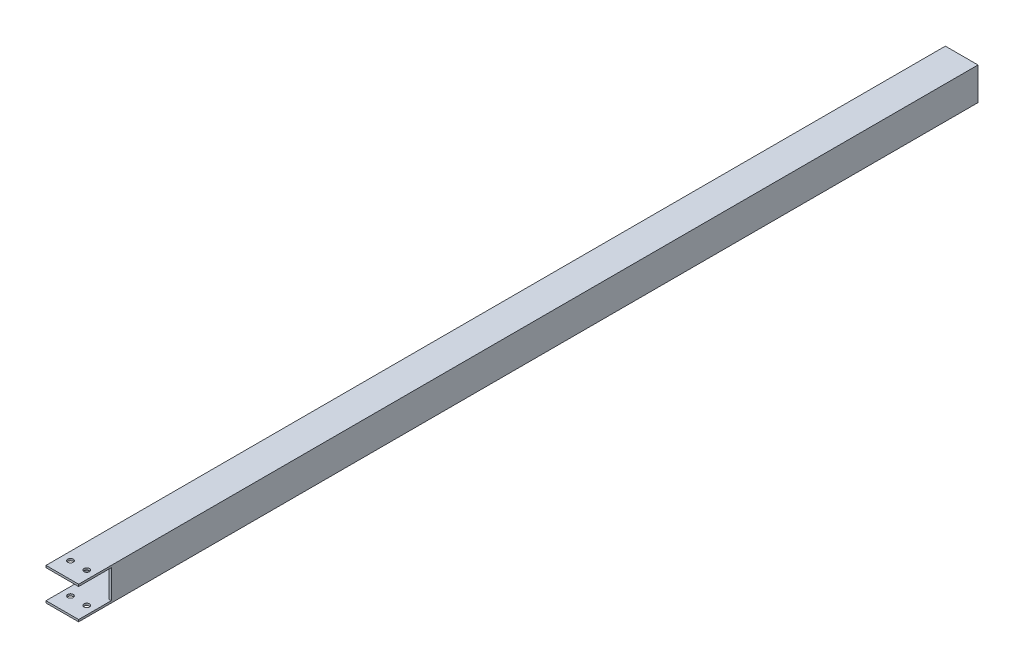
ISO-10303-21;
HEADER;
FILE_DESCRIPTION(('STEP AP214'),'2;1');
FILE_NAME('part.step','',(''),(''),'','','');
FILE_SCHEMA(('AUTOMOTIVE_DESIGN { 1 0 10303 214 1 1 1 1 }'));
ENDSEC;
DATA;
#1=APPLICATION_CONTEXT('core data for automotive mechanical design processes');
#2=APPLICATION_PROTOCOL_DEFINITION('international standard','automotive_design',2000,#1);
#3=PRODUCT_CONTEXT('',#1,'mechanical');
#4=PRODUCT('Part','Part','',(#3));
#5=PRODUCT_RELATED_PRODUCT_CATEGORY('part','',(#4));
#6=PRODUCT_DEFINITION_FORMATION('','',#4);
#7=PRODUCT_DEFINITION_CONTEXT('part definition',#1,'design');
#8=PRODUCT_DEFINITION('design','',#6,#7);
#9=PRODUCT_DEFINITION_SHAPE('','',#8);
#10=(LENGTH_UNIT() NAMED_UNIT(*) SI_UNIT(.MILLI.,.METRE.));
#11=(NAMED_UNIT(*) PLANE_ANGLE_UNIT() SI_UNIT($,.RADIAN.));
#12=(NAMED_UNIT(*) SI_UNIT($,.STERADIAN.) SOLID_ANGLE_UNIT());
#13=UNCERTAINTY_MEASURE_WITH_UNIT(LENGTH_MEASURE(1.E-05),#10,'distance_accuracy_value','');
#14=(GEOMETRIC_REPRESENTATION_CONTEXT(3) GLOBAL_UNCERTAINTY_ASSIGNED_CONTEXT((#13)) GLOBAL_UNIT_ASSIGNED_CONTEXT((#10,
#11,#12)) REPRESENTATION_CONTEXT('',''));
#15=CARTESIAN_POINT('',(0.,0.,0.));
#16=DIRECTION('',(0.,0.,1.));
#17=DIRECTION('',(1.,0.,0.));
#18=AXIS2_PLACEMENT_3D('',#15,#16,#17);
#19=CARTESIAN_POINT('',(0.,0.,350.));
#20=DIRECTION('',(0.,0.,1.));
#21=DIRECTION('',(1.,0.,0.));
#22=AXIS2_PLACEMENT_3D('',#19,#20,#21);
#23=PLANE('',#22);
#24=DIRECTION('',(-1.,0.,0.));
#25=VECTOR('',#24,1.);
#26=CARTESIAN_POINT('',(-11.1125,11.1125,350.));
#27=LINE('',#26,#25);
#28=CARTESIAN_POINT('',(12.7,11.1125,350.));
#29=VERTEX_POINT('',#28);
#30=CARTESIAN_POINT('',(-12.7,11.1125,350.));
#31=VERTEX_POINT('',#30);
#32=EDGE_CURVE('E141',#29,#31,#27,.T.);
#33=ORIENTED_EDGE('',*,*,#32,.F.);
#34=DIRECTION('',(0.,1.,0.));
#35=VECTOR('',#34,1.);
#36=CARTESIAN_POINT('',(12.7,12.7,350.));
#37=LINE('',#36,#35);
#38=CARTESIAN_POINT('',(12.7,12.7,350.));
#39=VERTEX_POINT('',#38);
#40=EDGE_CURVE('E188',#29,#39,#37,.T.);
#41=ORIENTED_EDGE('',*,*,#40,.T.);
#42=DIRECTION('',(-1.,0.,0.));
#43=VECTOR('',#42,1.);
#44=CARTESIAN_POINT('',(-12.7,12.7,350.));
#45=LINE('',#44,#43);
#46=CARTESIAN_POINT('',(-12.7,12.7,350.));
#47=VERTEX_POINT('',#46);
#48=EDGE_CURVE('E162',#39,#47,#45,.T.);
#49=ORIENTED_EDGE('',*,*,#48,.T.);
#50=DIRECTION('',(0.,-1.,0.));
#51=VECTOR('',#50,1.);
#52=CARTESIAN_POINT('',(-12.7,12.7,350.));
#53=LINE('',#52,#51);
#54=EDGE_CURVE('E161',#47,#31,#53,.T.);
#55=ORIENTED_EDGE('',*,*,#54,.T.);
#56=EDGE_LOOP('',(#33,#41,#49,#55));
#57=FACE_BOUND('',#56,.T.);
#58=ADVANCED_FACE('F40',(#57),#23,.T.);
#59=DIRECTION('',(1.,0.,0.));
#60=VECTOR('',#59,1.);
#61=CARTESIAN_POINT('',(-11.1125,-11.1125,350.));
#62=LINE('',#61,#60);
#63=CARTESIAN_POINT('',(-12.7,-11.1125,350.));
#64=VERTEX_POINT('',#63);
#65=CARTESIAN_POINT('',(12.7,-11.1125,350.));
#66=VERTEX_POINT('',#65);
#67=EDGE_CURVE('E131',#64,#66,#62,.T.);
#68=ORIENTED_EDGE('',*,*,#67,.F.);
#69=CARTESIAN_POINT('',(-12.7,-12.7,350.));
#70=VERTEX_POINT('',#69);
#71=EDGE_CURVE('E135',#64,#70,#53,.T.);
#72=ORIENTED_EDGE('',*,*,#71,.T.);
#73=DIRECTION('',(1.,0.,0.));
#74=VECTOR('',#73,1.);
#75=CARTESIAN_POINT('',(-12.7,-12.7,350.));
#76=LINE('',#75,#74);
#77=CARTESIAN_POINT('',(12.7,-12.7,350.));
#78=VERTEX_POINT('',#77);
#79=EDGE_CURVE('E167',#70,#78,#76,.T.);
#80=ORIENTED_EDGE('',*,*,#79,.T.);
#81=EDGE_CURVE('E138',#78,#66,#37,.T.);
#82=ORIENTED_EDGE('',*,*,#81,.T.);
#83=EDGE_LOOP('',(#68,#72,#80,#82));
#84=FACE_BOUND('',#83,.T.);
#85=ADVANCED_FACE('F133',(#84),#23,.T.);
#86=CARTESIAN_POINT('',(0.,0.,-350.));
#87=DIRECTION('',(0.,0.,1.));
#88=DIRECTION('',(1.,0.,0.));
#89=AXIS2_PLACEMENT_3D('',#86,#87,#88);
#90=PLANE('',#89);
#91=DIRECTION('',(0.,1.,0.));
#92=VECTOR('',#91,1.);
#93=CARTESIAN_POINT('',(12.7,12.7,-350.));
#94=LINE('',#93,#92);
#95=CARTESIAN_POINT('',(12.7,-12.7,-350.));
#96=VERTEX_POINT('',#95);
#97=CARTESIAN_POINT('',(12.7,12.7,-350.));
#98=VERTEX_POINT('',#97);
#99=EDGE_CURVE('E174',#96,#98,#94,.T.);
#100=ORIENTED_EDGE('',*,*,#99,.F.);
#101=DIRECTION('',(1.,0.,0.));
#102=VECTOR('',#101,1.);
#103=CARTESIAN_POINT('',(-12.7,-12.7,-350.));
#104=LINE('',#103,#102);
#105=CARTESIAN_POINT('',(-12.7,-12.7,-350.));
#106=VERTEX_POINT('',#105);
#107=EDGE_CURVE('E185',#106,#96,#104,.T.);
#108=ORIENTED_EDGE('',*,*,#107,.F.);
#109=DIRECTION('',(0.,-1.,0.));
#110=VECTOR('',#109,1.);
#111=CARTESIAN_POINT('',(-12.7,12.7,-350.));
#112=LINE('',#111,#110);
#113=CARTESIAN_POINT('',(-12.7,12.7,-350.));
#114=VERTEX_POINT('',#113);
#115=EDGE_CURVE('E182',#114,#106,#112,.T.);
#116=ORIENTED_EDGE('',*,*,#115,.F.);
#117=DIRECTION('',(-1.,0.,0.));
#118=VECTOR('',#117,1.);
#119=CARTESIAN_POINT('',(-12.7,12.7,-350.));
#120=LINE('',#119,#118);
#121=EDGE_CURVE('E178',#98,#114,#120,.T.);
#122=ORIENTED_EDGE('',*,*,#121,.F.);
#123=EDGE_LOOP('',(#100,#108,#116,#122));
#124=FACE_BOUND('',#123,.T.);
#125=DIRECTION('',(0.,1.,0.));
#126=VECTOR('',#125,1.);
#127=CARTESIAN_POINT('',(11.1125,11.1125,-350.));
#128=LINE('',#127,#126);
#129=CARTESIAN_POINT('',(11.1125,-11.1125,-350.));
#130=VERTEX_POINT('',#129);
#131=CARTESIAN_POINT('',(11.1125,11.1125,-350.));
#132=VERTEX_POINT('',#131);
#133=EDGE_CURVE('E206',#130,#132,#128,.T.);
#134=ORIENTED_EDGE('',*,*,#133,.T.);
#135=DIRECTION('',(-1.,0.,0.));
#136=VECTOR('',#135,1.);
#137=CARTESIAN_POINT('',(-11.1125,11.1125,-350.));
#138=LINE('',#137,#136);
#139=CARTESIAN_POINT('',(-11.1125,11.1125,-350.));
#140=VERTEX_POINT('',#139);
#141=EDGE_CURVE('E226',#132,#140,#138,.T.);
#142=ORIENTED_EDGE('',*,*,#141,.T.);
#143=DIRECTION('',(0.,-1.,0.));
#144=VECTOR('',#143,1.);
#145=CARTESIAN_POINT('',(-11.1125,11.1125,-350.));
#146=LINE('',#145,#144);
#147=CARTESIAN_POINT('',(-11.1125,-11.1125,-350.));
#148=VERTEX_POINT('',#147);
#149=EDGE_CURVE('E230',#140,#148,#146,.T.);
#150=ORIENTED_EDGE('',*,*,#149,.T.);
#151=DIRECTION('',(1.,0.,0.));
#152=VECTOR('',#151,1.);
#153=CARTESIAN_POINT('',(-11.1125,-11.1125,-350.));
#154=LINE('',#153,#152);
#155=EDGE_CURVE('E221',#148,#130,#154,.T.);
#156=ORIENTED_EDGE('',*,*,#155,.T.);
#157=EDGE_LOOP('',(#134,#142,#150,#156));
#158=FACE_BOUND('',#157,.T.);
#159=ADVANCED_FACE('F263',(#124,#158),#90,.F.);
#160=CARTESIAN_POINT('',(12.7,12.7,350.));
#161=DIRECTION('',(-1.,0.,0.));
#162=DIRECTION('',(0.,0.,1.));
#163=AXIS2_PLACEMENT_3D('',#160,#161,#162);
#164=PLANE('',#163);
#165=ORIENTED_EDGE('',*,*,#40,.F.);
#166=DIRECTION('',(0.,0.,1.));
#167=VECTOR('',#166,1.);
#168=CARTESIAN_POINT('',(12.7,11.1125,350.));
#169=LINE('',#168,#167);
#170=CARTESIAN_POINT('',(12.7,11.1125,324.6));
#171=VERTEX_POINT('',#170);
#172=EDGE_CURVE('E154',#171,#29,#169,.T.);
#173=ORIENTED_EDGE('',*,*,#172,.F.);
#174=DIRECTION('',(0.,1.,0.));
#175=VECTOR('',#174,1.);
#176=CARTESIAN_POINT('',(12.7,11.1125,324.6));
#177=LINE('',#176,#175);
#178=CARTESIAN_POINT('',(12.7,-11.1125,324.6));
#179=VERTEX_POINT('',#178);
#180=EDGE_CURVE('E281',#179,#171,#177,.T.);
#181=ORIENTED_EDGE('',*,*,#180,.F.);
#182=DIRECTION('',(0.,0.,-1.));
#183=VECTOR('',#182,1.);
#184=CARTESIAN_POINT('',(12.7,-11.1125,350.));
#185=LINE('',#184,#183);
#186=EDGE_CURVE('E278',#66,#179,#185,.T.);
#187=ORIENTED_EDGE('',*,*,#186,.F.);
#188=ORIENTED_EDGE('',*,*,#81,.F.);
#189=DIRECTION('',(0.,0.,-1.));
#190=VECTOR('',#189,1.);
#191=CARTESIAN_POINT('',(12.7,-12.7,350.));
#192=LINE('',#191,#190);
#193=EDGE_CURVE('E173',#78,#96,#192,.T.);
#194=ORIENTED_EDGE('',*,*,#193,.T.);
#195=ORIENTED_EDGE('',*,*,#99,.T.);
#196=DIRECTION('',(0.,0.,-1.));
#197=VECTOR('',#196,1.);
#198=CARTESIAN_POINT('',(12.7,12.7,350.));
#199=LINE('',#198,#197);
#200=EDGE_CURVE('E11',#39,#98,#199,.T.);
#201=ORIENTED_EDGE('',*,*,#200,.F.);
#202=EDGE_LOOP('',(#165,#173,#181,#187,#188,#194,#195,#201));
#203=FACE_BOUND('',#202,.T.);
#204=ADVANCED_FACE('F42',(#203),#164,.F.);
#205=CARTESIAN_POINT('',(-12.7,12.7,350.));
#206=DIRECTION('',(0.,-1.,0.));
#207=DIRECTION('',(1.,0.,0.));
#208=AXIS2_PLACEMENT_3D('',#205,#206,#207);
#209=PLANE('',#208);
#210=CARTESIAN_POINT('',(-6.35,12.7,337.3));
#211=DIRECTION('',(0.,1.,0.));
#212=DIRECTION('',(-1.,0.,0.));
#213=AXIS2_PLACEMENT_3D('',#210,#211,#212);
#214=CIRCLE('',#213,2.159);
#215=CARTESIAN_POINT('',(-8.50900000000001,12.7,337.3));
#216=VERTEX_POINT('',#215);
#217=EDGE_CURVE('E299',#216,#216,#214,.T.);
#218=ORIENTED_EDGE('',*,*,#217,.F.);
#219=EDGE_LOOP('',(#218));
#220=FACE_BOUND('',#219,.T.);
#221=CARTESIAN_POINT('',(6.35,12.7,337.3));
#222=DIRECTION('',(0.,-1.,0.));
#223=DIRECTION('',(1.,0.,0.));
#224=AXIS2_PLACEMENT_3D('',#221,#222,#223);
#225=CIRCLE('',#224,2.159);
#226=CARTESIAN_POINT('',(8.50900000000001,12.7,337.3));
#227=VERTEX_POINT('',#226);
#228=EDGE_CURVE('E200',#227,#227,#225,.T.);
#229=ORIENTED_EDGE('',*,*,#228,.T.);
#230=EDGE_LOOP('',(#229));
#231=FACE_BOUND('',#230,.T.);
#232=ORIENTED_EDGE('',*,*,#121,.T.);
#233=DIRECTION('',(0.,0.,-1.));
#234=VECTOR('',#233,1.);
#235=CARTESIAN_POINT('',(-12.7,12.7,350.));
#236=LINE('',#235,#234);
#237=EDGE_CURVE('E50',#47,#114,#236,.T.);
#238=ORIENTED_EDGE('',*,*,#237,.F.);
#239=ORIENTED_EDGE('',*,*,#48,.F.);
#240=ORIENTED_EDGE('',*,*,#200,.T.);
#241=EDGE_LOOP('',(#232,#238,#239,#240));
#242=FACE_BOUND('',#241,.T.);
#243=ADVANCED_FACE('F257',(#220,#231,#242),#209,.F.);
#244=CARTESIAN_POINT('',(-12.7,12.7,350.));
#245=DIRECTION('',(1.,0.,0.));
#246=DIRECTION('',(0.,0.,-1.));
#247=AXIS2_PLACEMENT_3D('',#244,#245,#246);
#248=PLANE('',#247);
#249=DIRECTION('',(0.,1.,0.));
#250=VECTOR('',#249,1.);
#251=CARTESIAN_POINT('',(-12.7,11.1125,324.6));
#252=LINE('',#251,#250);
#253=CARTESIAN_POINT('',(-12.7,-11.1125,324.6));
#254=VERTEX_POINT('',#253);
#255=CARTESIAN_POINT('',(-12.7,11.1125,324.6));
#256=VERTEX_POINT('',#255);
#257=EDGE_CURVE('E153',#254,#256,#252,.T.);
#258=ORIENTED_EDGE('',*,*,#257,.T.);
#259=DIRECTION('',(0.,0.,1.));
#260=VECTOR('',#259,1.);
#261=CARTESIAN_POINT('',(-12.7,11.1125,350.));
#262=LINE('',#261,#260);
#263=EDGE_CURVE('E268',#256,#31,#262,.T.);
#264=ORIENTED_EDGE('',*,*,#263,.T.);
#265=ORIENTED_EDGE('',*,*,#54,.F.);
#266=ORIENTED_EDGE('',*,*,#237,.T.);
#267=ORIENTED_EDGE('',*,*,#115,.T.);
#268=DIRECTION('',(0.,0.,-1.));
#269=VECTOR('',#268,1.);
#270=CARTESIAN_POINT('',(-12.7,-12.7,350.));
#271=LINE('',#270,#269);
#272=EDGE_CURVE('E158',#70,#106,#271,.T.);
#273=ORIENTED_EDGE('',*,*,#272,.F.);
#274=ORIENTED_EDGE('',*,*,#71,.F.);
#275=DIRECTION('',(0.,0.,-1.));
#276=VECTOR('',#275,1.);
#277=CARTESIAN_POINT('',(-12.7,-11.1125,350.));
#278=LINE('',#277,#276);
#279=EDGE_CURVE('E144',#64,#254,#278,.T.);
#280=ORIENTED_EDGE('',*,*,#279,.T.);
#281=EDGE_LOOP('',(#258,#264,#265,#266,#267,#273,#274,#280));
#282=FACE_BOUND('',#281,.T.);
#283=ADVANCED_FACE('F156',(#282),#248,.F.);
#284=CARTESIAN_POINT('',(-12.7,-12.7,350.));
#285=DIRECTION('',(0.,1.,0.));
#286=DIRECTION('',(-1.,0.,0.));
#287=AXIS2_PLACEMENT_3D('',#284,#285,#286);
#288=PLANE('',#287);
#289=CARTESIAN_POINT('',(-6.35,-12.7,337.3));
#290=DIRECTION('',(0.,1.,0.));
#291=DIRECTION('',(-1.,0.,0.));
#292=AXIS2_PLACEMENT_3D('',#289,#290,#291);
#293=CIRCLE('',#292,2.159);
#294=CARTESIAN_POINT('',(-8.50900000000001,-12.7,337.3));
#295=VERTEX_POINT('',#294);
#296=EDGE_CURVE('E298',#295,#295,#293,.T.);
#297=ORIENTED_EDGE('',*,*,#296,.T.);
#298=EDGE_LOOP('',(#297));
#299=FACE_BOUND('',#298,.T.);
#300=CARTESIAN_POINT('',(6.35,-12.7,337.3));
#301=DIRECTION('',(0.,-1.,0.));
#302=DIRECTION('',(1.,0.,0.));
#303=AXIS2_PLACEMENT_3D('',#300,#301,#302);
#304=CIRCLE('',#303,2.159);
#305=CARTESIAN_POINT('',(8.50900000000001,-12.7,337.3));
#306=VERTEX_POINT('',#305);
#307=EDGE_CURVE('E209',#306,#306,#304,.T.);
#308=ORIENTED_EDGE('',*,*,#307,.F.);
#309=EDGE_LOOP('',(#308));
#310=FACE_BOUND('',#309,.T.);
#311=ORIENTED_EDGE('',*,*,#107,.T.);
#312=ORIENTED_EDGE('',*,*,#193,.F.);
#313=ORIENTED_EDGE('',*,*,#79,.F.);
#314=ORIENTED_EDGE('',*,*,#272,.T.);
#315=EDGE_LOOP('',(#311,#312,#313,#314));
#316=FACE_BOUND('',#315,.T.);
#317=ADVANCED_FACE('F306',(#299,#310,#316),#288,.F.);
#318=CARTESIAN_POINT('',(11.1125,11.1125,350.));
#319=DIRECTION('',(-1.,0.,0.));
#320=DIRECTION('',(0.,0.,1.));
#321=AXIS2_PLACEMENT_3D('',#318,#319,#320);
#322=PLANE('',#321);
#323=DIRECTION('',(0.,-1.,0.));
#324=VECTOR('',#323,1.);
#325=CARTESIAN_POINT('',(11.1125,11.1125,324.6));
#326=LINE('',#325,#324);
#327=CARTESIAN_POINT('',(11.1125,11.1125,324.6));
#328=VERTEX_POINT('',#327);
#329=CARTESIAN_POINT('',(11.1125,-11.1125,324.6));
#330=VERTEX_POINT('',#329);
#331=EDGE_CURVE('E295',#328,#330,#326,.T.);
#332=ORIENTED_EDGE('',*,*,#331,.F.);
#333=DIRECTION('',(0.,0.,-1.));
#334=VECTOR('',#333,1.);
#335=CARTESIAN_POINT('',(11.1125,11.1125,350.));
#336=LINE('',#335,#334);
#337=EDGE_CURVE('E179',#328,#132,#336,.T.);
#338=ORIENTED_EDGE('',*,*,#337,.T.);
#339=ORIENTED_EDGE('',*,*,#133,.F.);
#340=DIRECTION('',(0.,0.,-1.));
#341=VECTOR('',#340,1.);
#342=CARTESIAN_POINT('',(11.1125,-11.1125,350.));
#343=LINE('',#342,#341);
#344=EDGE_CURVE('E63',#330,#130,#343,.T.);
#345=ORIENTED_EDGE('',*,*,#344,.F.);
#346=EDGE_LOOP('',(#332,#338,#339,#345));
#347=FACE_BOUND('',#346,.T.);
#348=ADVANCED_FACE('F333',(#347),#322,.T.);
#349=CARTESIAN_POINT('',(-11.1125,11.1125,350.));
#350=DIRECTION('',(0.,-1.,0.));
#351=DIRECTION('',(0.,0.,-1.));
#352=AXIS2_PLACEMENT_3D('',#349,#350,#351);
#353=PLANE('',#352);
#354=ORIENTED_EDGE('',*,*,#337,.F.);
#355=DIRECTION('',(1.,0.,0.));
#356=VECTOR('',#355,1.);
#357=CARTESIAN_POINT('',(-12.7,11.1125,324.6));
#358=LINE('',#357,#356);
#359=EDGE_CURVE('E290',#328,#171,#358,.T.);
#360=ORIENTED_EDGE('',*,*,#359,.T.);
#361=ORIENTED_EDGE('',*,*,#172,.T.);
#362=ORIENTED_EDGE('',*,*,#32,.T.);
#363=ORIENTED_EDGE('',*,*,#263,.F.);
#364=CARTESIAN_POINT('',(-11.1125,11.1125,324.6));
#365=VERTEX_POINT('',#364);
#366=EDGE_CURVE('E287',#256,#365,#358,.T.);
#367=ORIENTED_EDGE('',*,*,#366,.T.);
#368=DIRECTION('',(0.,0.,-1.));
#369=VECTOR('',#368,1.);
#370=CARTESIAN_POINT('',(-11.1125,11.1125,350.));
#371=LINE('',#370,#369);
#372=EDGE_CURVE('E242',#365,#140,#371,.T.);
#373=ORIENTED_EDGE('',*,*,#372,.T.);
#374=ORIENTED_EDGE('',*,*,#141,.F.);
#375=EDGE_LOOP('',(#354,#360,#361,#362,#363,#367,#373,#374));
#376=FACE_BOUND('',#375,.T.);
#377=CARTESIAN_POINT('',(-6.35,11.1125,337.3));
#378=DIRECTION('',(0.,-1.,0.));
#379=DIRECTION('',(0.,0.,-1.));
#380=AXIS2_PLACEMENT_3D('',#377,#378,#379);
#381=CIRCLE('',#380,2.159);
#382=CARTESIAN_POINT('',(-6.35,11.1125,335.141));
#383=VERTEX_POINT('',#382);
#384=EDGE_CURVE('E215',#383,#383,#381,.F.);
#385=ORIENTED_EDGE('',*,*,#384,.T.);
#386=EDGE_LOOP('',(#385));
#387=FACE_BOUND('',#386,.T.);
#388=CARTESIAN_POINT('',(6.35,11.1125,337.3));
#389=DIRECTION('',(0.,-1.,0.));
#390=DIRECTION('',(0.,0.,-1.));
#391=AXIS2_PLACEMENT_3D('',#388,#389,#390);
#392=CIRCLE('',#391,2.159);
#393=CARTESIAN_POINT('',(6.35,11.1125,335.141));
#394=VERTEX_POINT('',#393);
#395=EDGE_CURVE('E199',#394,#394,#392,.T.);
#396=ORIENTED_EDGE('',*,*,#395,.F.);
#397=EDGE_LOOP('',(#396));
#398=FACE_BOUND('',#397,.T.);
#399=ADVANCED_FACE('F417',(#376,#387,#398),#353,.T.);
#400=CARTESIAN_POINT('',(-11.1125,11.1125,350.));
#401=DIRECTION('',(1.,0.,0.));
#402=DIRECTION('',(0.,0.,-1.));
#403=AXIS2_PLACEMENT_3D('',#400,#401,#402);
#404=PLANE('',#403);
#405=DIRECTION('',(0.,1.,0.));
#406=VECTOR('',#405,1.);
#407=CARTESIAN_POINT('',(-11.1125,11.1125,324.6));
#408=LINE('',#407,#406);
#409=CARTESIAN_POINT('',(-11.1125,-11.1125,324.6));
#410=VERTEX_POINT('',#409);
#411=EDGE_CURVE('E289',#410,#365,#408,.T.);
#412=ORIENTED_EDGE('',*,*,#411,.F.);
#413=DIRECTION('',(0.,0.,-1.));
#414=VECTOR('',#413,1.);
#415=CARTESIAN_POINT('',(-11.1125,-11.1125,350.));
#416=LINE('',#415,#414);
#417=EDGE_CURVE('E239',#410,#148,#416,.T.);
#418=ORIENTED_EDGE('',*,*,#417,.T.);
#419=ORIENTED_EDGE('',*,*,#149,.F.);
#420=ORIENTED_EDGE('',*,*,#372,.F.);
#421=EDGE_LOOP('',(#412,#418,#419,#420));
#422=FACE_BOUND('',#421,.T.);
#423=ADVANCED_FACE('F409',(#422),#404,.T.);
#424=CARTESIAN_POINT('',(-11.1125,-11.1125,350.));
#425=DIRECTION('',(0.,1.,0.));
#426=DIRECTION('',(0.,0.,1.));
#427=AXIS2_PLACEMENT_3D('',#424,#425,#426);
#428=PLANE('',#427);
#429=ORIENTED_EDGE('',*,*,#417,.F.);
#430=DIRECTION('',(1.,0.,0.));
#431=VECTOR('',#430,1.);
#432=CARTESIAN_POINT('',(-12.7,-11.1125,324.6));
#433=LINE('',#432,#431);
#434=EDGE_CURVE('E148',#254,#410,#433,.T.);
#435=ORIENTED_EDGE('',*,*,#434,.F.);
#436=ORIENTED_EDGE('',*,*,#279,.F.);
#437=ORIENTED_EDGE('',*,*,#67,.T.);
#438=ORIENTED_EDGE('',*,*,#186,.T.);
#439=EDGE_CURVE('E58',#330,#179,#433,.T.);
#440=ORIENTED_EDGE('',*,*,#439,.F.);
#441=ORIENTED_EDGE('',*,*,#344,.T.);
#442=ORIENTED_EDGE('',*,*,#155,.F.);
#443=EDGE_LOOP('',(#429,#435,#436,#437,#438,#440,#441,#442));
#444=FACE_BOUND('',#443,.T.);
#445=CARTESIAN_POINT('',(-6.35,-11.1125,337.3));
#446=DIRECTION('',(0.,1.,0.));
#447=DIRECTION('',(0.,0.,1.));
#448=AXIS2_PLACEMENT_3D('',#445,#446,#447);
#449=CIRCLE('',#448,2.159);
#450=CARTESIAN_POINT('',(-6.35,-11.1125,339.459));
#451=VERTEX_POINT('',#450);
#452=EDGE_CURVE('E44',#451,#451,#449,.F.);
#453=ORIENTED_EDGE('',*,*,#452,.T.);
#454=EDGE_LOOP('',(#453));
#455=FACE_BOUND('',#454,.T.);
#456=CARTESIAN_POINT('',(6.35,-11.1125,337.3));
#457=DIRECTION('',(0.,1.,0.));
#458=DIRECTION('',(0.,0.,1.));
#459=AXIS2_PLACEMENT_3D('',#456,#457,#458);
#460=CIRCLE('',#459,2.159);
#461=CARTESIAN_POINT('',(6.35,-11.1125,339.459));
#462=VERTEX_POINT('',#461);
#463=EDGE_CURVE('E196',#462,#462,#460,.T.);
#464=ORIENTED_EDGE('',*,*,#463,.F.);
#465=EDGE_LOOP('',(#464));
#466=FACE_BOUND('',#465,.T.);
#467=ADVANCED_FACE('F146',(#444,#455,#466),#428,.T.);
#468=CARTESIAN_POINT('',(6.35,12.7,337.3));
#469=DIRECTION('',(0.,-1.,0.));
#470=DIRECTION('',(1.,0.,0.));
#471=AXIS2_PLACEMENT_3D('',#468,#469,#470);
#472=CYLINDRICAL_SURFACE('',#471,2.159);
#473=ORIENTED_EDGE('',*,*,#463,.T.);
#474=EDGE_LOOP('',(#473));
#475=FACE_BOUND('',#474,.T.);
#476=ORIENTED_EDGE('',*,*,#307,.T.);
#477=EDGE_LOOP('',(#476));
#478=FACE_BOUND('',#477,.T.);
#479=ADVANCED_FACE('F321',(#475,#478),#472,.F.);
#480=ORIENTED_EDGE('',*,*,#395,.T.);
#481=EDGE_LOOP('',(#480));
#482=FACE_BOUND('',#481,.T.);
#483=ORIENTED_EDGE('',*,*,#228,.F.);
#484=EDGE_LOOP('',(#483));
#485=FACE_BOUND('',#484,.T.);
#486=ADVANCED_FACE('F312',(#482,#485),#472,.F.);
#487=CARTESIAN_POINT('',(-6.35,12.7,337.3));
#488=DIRECTION('',(0.,-1.,0.));
#489=DIRECTION('',(1.,0.,0.));
#490=AXIS2_PLACEMENT_3D('',#487,#488,#489);
#491=CYLINDRICAL_SURFACE('',#490,2.159);
#492=ORIENTED_EDGE('',*,*,#452,.F.);
#493=EDGE_LOOP('',(#492));
#494=FACE_BOUND('',#493,.T.);
#495=ORIENTED_EDGE('',*,*,#296,.F.);
#496=EDGE_LOOP('',(#495));
#497=FACE_BOUND('',#496,.T.);
#498=ADVANCED_FACE('F309',(#494,#497),#491,.F.);
#499=ORIENTED_EDGE('',*,*,#384,.F.);
#500=EDGE_LOOP('',(#499));
#501=FACE_BOUND('',#500,.T.);
#502=ORIENTED_EDGE('',*,*,#217,.T.);
#503=EDGE_LOOP('',(#502));
#504=FACE_BOUND('',#503,.T.);
#505=ADVANCED_FACE('F311',(#501,#504),#491,.F.);
#506=CARTESIAN_POINT('',(-12.7,11.1125,324.6));
#507=DIRECTION('',(0.,0.,-1.));
#508=DIRECTION('',(-1.,0.,0.));
#509=AXIS2_PLACEMENT_3D('',#506,#507,#508);
#510=PLANE('',#509);
#511=ORIENTED_EDGE('',*,*,#411,.T.);
#512=ORIENTED_EDGE('',*,*,#366,.F.);
#513=ORIENTED_EDGE('',*,*,#257,.F.);
#514=ORIENTED_EDGE('',*,*,#434,.T.);
#515=EDGE_LOOP('',(#511,#512,#513,#514));
#516=FACE_BOUND('',#515,.T.);
#517=ADVANCED_FACE('F319',(#516),#510,.F.);
#518=ORIENTED_EDGE('',*,*,#331,.T.);
#519=ORIENTED_EDGE('',*,*,#439,.T.);
#520=ORIENTED_EDGE('',*,*,#180,.T.);
#521=ORIENTED_EDGE('',*,*,#359,.F.);
#522=EDGE_LOOP('',(#518,#519,#520,#521));
#523=FACE_BOUND('',#522,.T.);
#524=ADVANCED_FACE('F450',(#523),#510,.F.);
#525=CLOSED_SHELL('',(#58,#85,#159,#204,#243,#283,#317,#348,#399,#423,#467,#479,#486,#498,#505,
#517,#524));
#526=MANIFOLD_SOLID_BREP('B2',#525);
#527=ADVANCED_BREP_SHAPE_REPRESENTATION('',(#18,#526),#14);
#528=SHAPE_DEFINITION_REPRESENTATION(#9,#527);
ENDSEC;
END-ISO-10303-21;
